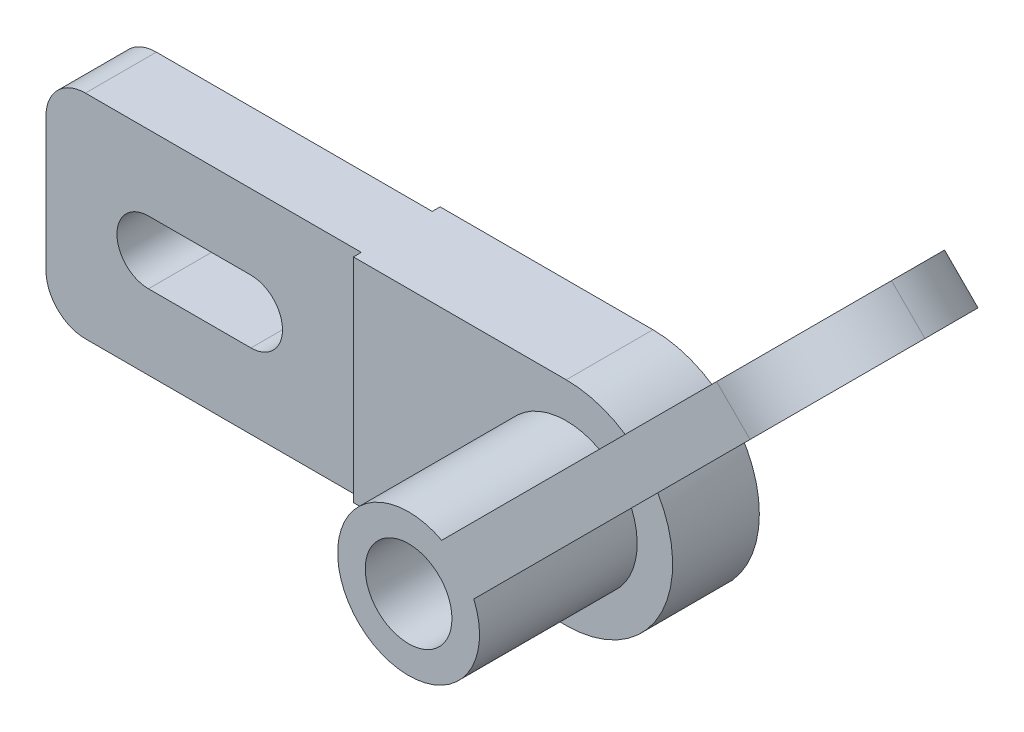
ISO-10303-21;
HEADER;
FILE_DESCRIPTION(('STEP AP214'),'2;1');
FILE_NAME('part.step','',(''),(''),'','','');
FILE_SCHEMA(('AUTOMOTIVE_DESIGN { 1 0 10303 214 1 1 1 1 }'));
ENDSEC;
DATA;
#1=APPLICATION_CONTEXT('core data for automotive mechanical design processes');
#2=APPLICATION_PROTOCOL_DEFINITION('international standard','automotive_design',2000,#1);
#3=PRODUCT_CONTEXT('',#1,'mechanical');
#4=PRODUCT('Part','Part','',(#3));
#5=PRODUCT_RELATED_PRODUCT_CATEGORY('part','',(#4));
#6=PRODUCT_DEFINITION_FORMATION('','',#4);
#7=PRODUCT_DEFINITION_CONTEXT('part definition',#1,'design');
#8=PRODUCT_DEFINITION('design','',#6,#7);
#9=PRODUCT_DEFINITION_SHAPE('','',#8);
#10=(LENGTH_UNIT() NAMED_UNIT(*) SI_UNIT(.MILLI.,.METRE.));
#11=(NAMED_UNIT(*) PLANE_ANGLE_UNIT() SI_UNIT($,.RADIAN.));
#12=(NAMED_UNIT(*) SI_UNIT($,.STERADIAN.) SOLID_ANGLE_UNIT());
#13=UNCERTAINTY_MEASURE_WITH_UNIT(LENGTH_MEASURE(1.E-05),#10,'distance_accuracy_value','');
#14=(GEOMETRIC_REPRESENTATION_CONTEXT(3) GLOBAL_UNCERTAINTY_ASSIGNED_CONTEXT((#13)) GLOBAL_UNIT_ASSIGNED_CONTEXT((#10,
#11,#12)) REPRESENTATION_CONTEXT('',''));
#15=CARTESIAN_POINT('',(0.,0.,0.));
#16=DIRECTION('',(0.,0.,1.));
#17=DIRECTION('',(1.,0.,0.));
#18=AXIS2_PLACEMENT_3D('',#15,#16,#17);
#19=CARTESIAN_POINT('',(-67.,13.5,11.));
#20=DIRECTION('',(1.,0.,0.));
#21=DIRECTION('',(0.,0.,-1.));
#22=AXIS2_PLACEMENT_3D('',#19,#20,#21);
#23=PLANE('',#22);
#24=DIRECTION('',(0.,-1.,0.));
#25=VECTOR('',#24,1.);
#26=CARTESIAN_POINT('',(-67.,13.5,1.));
#27=LINE('',#26,#25);
#28=CARTESIAN_POINT('',(-67.,8.5,1.));
#29=VERTEX_POINT('',#28);
#30=CARTESIAN_POINT('',(-67.,-8.5,1.));
#31=VERTEX_POINT('',#30);
#32=EDGE_CURVE('E269',#29,#31,#27,.T.);
#33=ORIENTED_EDGE('',*,*,#32,.T.);
#34=DIRECTION('',(0.,0.,-1.));
#35=VECTOR('',#34,1.);
#36=CARTESIAN_POINT('',(-67.,-8.5,11.));
#37=LINE('',#36,#35);
#38=CARTESIAN_POINT('',(-67.,-8.5,10.));
#39=VERTEX_POINT('',#38);
#40=EDGE_CURVE('E382',#31,#39,#37,.F.);
#41=ORIENTED_EDGE('',*,*,#40,.T.);
#42=DIRECTION('',(0.,-1.,0.));
#43=VECTOR('',#42,1.);
#44=CARTESIAN_POINT('',(-67.,13.5,10.));
#45=LINE('',#44,#43);
#46=CARTESIAN_POINT('',(-67.,8.5,10.));
#47=VERTEX_POINT('',#46);
#48=EDGE_CURVE('E288',#47,#39,#45,.T.);
#49=ORIENTED_EDGE('',*,*,#48,.F.);
#50=DIRECTION('',(0.,0.,-1.));
#51=VECTOR('',#50,1.);
#52=CARTESIAN_POINT('',(-67.,8.5,11.));
#53=LINE('',#52,#51);
#54=EDGE_CURVE('E379',#47,#29,#53,.T.);
#55=ORIENTED_EDGE('',*,*,#54,.T.);
#56=EDGE_LOOP('',(#33,#41,#49,#55));
#57=FACE_BOUND('',#56,.T.);
#58=ADVANCED_FACE('F33',(#57),#23,.F.);
#59=CARTESIAN_POINT('',(-54.,0.,-4.));
#60=DIRECTION('',(0.,0.,1.));
#61=DIRECTION('',(1.,0.,0.));
#62=AXIS2_PLACEMENT_3D('',#59,#60,#61);
#63=CYLINDRICAL_SURFACE('',#62,4.);
#64=CARTESIAN_POINT('',(-54.,0.,1.));
#65=DIRECTION('',(0.,0.,-1.));
#66=DIRECTION('',(-1.,0.,0.));
#67=AXIS2_PLACEMENT_3D('',#64,#65,#66);
#68=CIRCLE('',#67,4.);
#69=CARTESIAN_POINT('',(-54.,4.,1.));
#70=VERTEX_POINT('',#69);
#71=CARTESIAN_POINT('',(-54.,-4.,1.));
#72=VERTEX_POINT('',#71);
#73=EDGE_CURVE('E282',#70,#72,#68,.F.);
#74=ORIENTED_EDGE('',*,*,#73,.F.);
#75=DIRECTION('',(0.,0.,1.));
#76=VECTOR('',#75,1.);
#77=CARTESIAN_POINT('',(-54.,4.,-4.));
#78=LINE('',#77,#76);
#79=CARTESIAN_POINT('',(-54.,4.,10.));
#80=VERTEX_POINT('',#79);
#81=EDGE_CURVE('E319',#70,#80,#78,.T.);
#82=ORIENTED_EDGE('',*,*,#81,.T.);
#83=CARTESIAN_POINT('',(-54.,0.,10.));
#84=DIRECTION('',(0.,0.,1.));
#85=DIRECTION('',(1.,0.,0.));
#86=AXIS2_PLACEMENT_3D('',#83,#84,#85);
#87=CIRCLE('',#86,4.);
#88=CARTESIAN_POINT('',(-54.,-4.,10.));
#89=VERTEX_POINT('',#88);
#90=EDGE_CURVE('E309',#89,#80,#87,.F.);
#91=ORIENTED_EDGE('',*,*,#90,.F.);
#92=DIRECTION('',(0.,0.,1.));
#93=VECTOR('',#92,1.);
#94=CARTESIAN_POINT('',(-54.,-4.,-4.));
#95=LINE('',#94,#93);
#96=EDGE_CURVE('E316',#72,#89,#95,.T.);
#97=ORIENTED_EDGE('',*,*,#96,.F.);
#98=EDGE_LOOP('',(#74,#82,#91,#97));
#99=FACE_BOUND('',#98,.T.);
#100=ADVANCED_FACE('F413',(#99),#63,.F.);
#101=CARTESIAN_POINT('',(-54.,4.,-4.));
#102=DIRECTION('',(0.,1.,0.));
#103=DIRECTION('',(0.,0.,1.));
#104=AXIS2_PLACEMENT_3D('',#101,#102,#103);
#105=PLANE('',#104);
#106=DIRECTION('',(-1.,0.,0.));
#107=VECTOR('',#106,1.);
#108=CARTESIAN_POINT('',(-54.,4.,1.));
#109=LINE('',#108,#107);
#110=CARTESIAN_POINT('',(-41.,4.,1.));
#111=VERTEX_POINT('',#110);
#112=EDGE_CURVE('E280',#111,#70,#109,.T.);
#113=ORIENTED_EDGE('',*,*,#112,.F.);
#114=DIRECTION('',(0.,0.,1.));
#115=VECTOR('',#114,1.);
#116=CARTESIAN_POINT('',(-41.,4.,-4.));
#117=LINE('',#116,#115);
#118=CARTESIAN_POINT('',(-41.,4.,10.));
#119=VERTEX_POINT('',#118);
#120=EDGE_CURVE('E322',#111,#119,#117,.T.);
#121=ORIENTED_EDGE('',*,*,#120,.T.);
#122=DIRECTION('',(1.,0.,0.));
#123=VECTOR('',#122,1.);
#124=CARTESIAN_POINT('',(-54.,4.,10.));
#125=LINE('',#124,#123);
#126=EDGE_CURVE('E306',#80,#119,#125,.T.);
#127=ORIENTED_EDGE('',*,*,#126,.F.);
#128=ORIENTED_EDGE('',*,*,#81,.F.);
#129=EDGE_LOOP('',(#113,#121,#127,#128));
#130=FACE_BOUND('',#129,.T.);
#131=ADVANCED_FACE('F419',(#130),#105,.F.);
#132=CARTESIAN_POINT('',(-41.,0.,-4.));
#133=DIRECTION('',(0.,0.,1.));
#134=DIRECTION('',(1.,0.,0.));
#135=AXIS2_PLACEMENT_3D('',#132,#133,#134);
#136=CYLINDRICAL_SURFACE('',#135,4.);
#137=CARTESIAN_POINT('',(-41.,0.,1.));
#138=DIRECTION('',(0.,0.,-1.));
#139=DIRECTION('',(-1.,0.,0.));
#140=AXIS2_PLACEMENT_3D('',#137,#138,#139);
#141=CIRCLE('',#140,4.);
#142=CARTESIAN_POINT('',(-41.,-4.,1.));
#143=VERTEX_POINT('',#142);
#144=EDGE_CURVE('E277',#143,#111,#141,.F.);
#145=ORIENTED_EDGE('',*,*,#144,.F.);
#146=DIRECTION('',(0.,0.,1.));
#147=VECTOR('',#146,1.);
#148=CARTESIAN_POINT('',(-41.,-4.,-4.));
#149=LINE('',#148,#147);
#150=CARTESIAN_POINT('',(-41.,-4.,10.));
#151=VERTEX_POINT('',#150);
#152=EDGE_CURVE('E324',#143,#151,#149,.T.);
#153=ORIENTED_EDGE('',*,*,#152,.T.);
#154=CARTESIAN_POINT('',(-41.,0.,10.));
#155=DIRECTION('',(0.,0.,1.));
#156=DIRECTION('',(1.,0.,0.));
#157=AXIS2_PLACEMENT_3D('',#154,#155,#156);
#158=CIRCLE('',#157,4.);
#159=EDGE_CURVE('E302',#119,#151,#158,.F.);
#160=ORIENTED_EDGE('',*,*,#159,.F.);
#161=ORIENTED_EDGE('',*,*,#120,.F.);
#162=EDGE_LOOP('',(#145,#153,#160,#161));
#163=FACE_BOUND('',#162,.T.);
#164=ADVANCED_FACE('F535',(#163),#136,.F.);
#165=CARTESIAN_POINT('',(-54.,-4.,-4.));
#166=DIRECTION('',(0.,-1.,0.));
#167=DIRECTION('',(0.,0.,-1.));
#168=AXIS2_PLACEMENT_3D('',#165,#166,#167);
#169=PLANE('',#168);
#170=DIRECTION('',(1.,0.,0.));
#171=VECTOR('',#170,1.);
#172=CARTESIAN_POINT('',(-54.,-4.,1.));
#173=LINE('',#172,#171);
#174=EDGE_CURVE('E352',#72,#143,#173,.T.);
#175=ORIENTED_EDGE('',*,*,#174,.F.);
#176=ORIENTED_EDGE('',*,*,#96,.T.);
#177=DIRECTION('',(-1.,0.,0.));
#178=VECTOR('',#177,1.);
#179=CARTESIAN_POINT('',(-54.,-4.,10.));
#180=LINE('',#179,#178);
#181=EDGE_CURVE('E349',#151,#89,#180,.T.);
#182=ORIENTED_EDGE('',*,*,#181,.F.);
#183=ORIENTED_EDGE('',*,*,#152,.F.);
#184=EDGE_LOOP('',(#175,#176,#182,#183));
#185=FACE_BOUND('',#184,.T.);
#186=ADVANCED_FACE('F429',(#185),#169,.F.);
#187=CARTESIAN_POINT('',(-67.,13.5,11.));
#188=DIRECTION('',(0.,-1.,0.));
#189=DIRECTION('',(0.,0.,-1.));
#190=AXIS2_PLACEMENT_3D('',#187,#188,#189);
#191=PLANE('',#190);
#192=DIRECTION('',(-1.,0.,0.));
#193=VECTOR('',#192,1.);
#194=CARTESIAN_POINT('',(-27.,13.5,1.));
#195=LINE('',#194,#193);
#196=CARTESIAN_POINT('',(-27.,13.5,1.));
#197=VERTEX_POINT('',#196);
#198=CARTESIAN_POINT('',(-62.,13.5,1.));
#199=VERTEX_POINT('',#198);
#200=EDGE_CURVE('E261',#197,#199,#195,.T.);
#201=ORIENTED_EDGE('',*,*,#200,.T.);
#202=DIRECTION('',(0.,0.,-1.));
#203=VECTOR('',#202,1.);
#204=CARTESIAN_POINT('',(-62.,13.5,11.));
#205=LINE('',#204,#203);
#206=CARTESIAN_POINT('',(-62.,13.5,10.));
#207=VERTEX_POINT('',#206);
#208=EDGE_CURVE('E388',#199,#207,#205,.F.);
#209=ORIENTED_EDGE('',*,*,#208,.T.);
#210=DIRECTION('',(-1.,0.,0.));
#211=VECTOR('',#210,1.);
#212=CARTESIAN_POINT('',(-27.,13.5,10.));
#213=LINE('',#212,#211);
#214=CARTESIAN_POINT('',(-27.,13.5,10.));
#215=VERTEX_POINT('',#214);
#216=EDGE_CURVE('E285',#215,#207,#213,.T.);
#217=ORIENTED_EDGE('',*,*,#216,.F.);
#218=DIRECTION('',(0.,0.,1.));
#219=VECTOR('',#218,1.);
#220=CARTESIAN_POINT('',(-27.,13.5,10.));
#221=LINE('',#220,#219);
#222=CARTESIAN_POINT('',(-27.,13.5,11.));
#223=VERTEX_POINT('',#222);
#224=EDGE_CURVE('E299',#215,#223,#221,.T.);
#225=ORIENTED_EDGE('',*,*,#224,.T.);
#226=DIRECTION('',(-1.,0.,0.));
#227=VECTOR('',#226,1.);
#228=CARTESIAN_POINT('',(-67.,13.5,11.));
#229=LINE('',#228,#227);
#230=CARTESIAN_POINT('',(0.,13.5,11.));
#231=VERTEX_POINT('',#230);
#232=EDGE_CURVE('E330',#231,#223,#229,.T.);
#233=ORIENTED_EDGE('',*,*,#232,.F.);
#234=DIRECTION('',(0.,0.,-1.));
#235=VECTOR('',#234,1.);
#236=CARTESIAN_POINT('',(0.,13.5,11.));
#237=LINE('',#236,#235);
#238=CARTESIAN_POINT('',(0.,13.5,0.));
#239=VERTEX_POINT('',#238);
#240=EDGE_CURVE('E346',#231,#239,#237,.T.);
#241=ORIENTED_EDGE('',*,*,#240,.T.);
#242=DIRECTION('',(-1.,0.,0.));
#243=VECTOR('',#242,1.);
#244=CARTESIAN_POINT('',(-67.,13.5,0.));
#245=LINE('',#244,#243);
#246=CARTESIAN_POINT('',(-27.,13.5,0.));
#247=VERTEX_POINT('',#246);
#248=EDGE_CURVE('E339',#239,#247,#245,.T.);
#249=ORIENTED_EDGE('',*,*,#248,.T.);
#250=DIRECTION('',(0.,0.,-1.));
#251=VECTOR('',#250,1.);
#252=CARTESIAN_POINT('',(-27.,13.5,1.));
#253=LINE('',#252,#251);
#254=EDGE_CURVE('E272',#197,#247,#253,.T.);
#255=ORIENTED_EDGE('',*,*,#254,.F.);
#256=EDGE_LOOP('',(#201,#209,#217,#225,#233,#241,#249,#255));
#257=FACE_BOUND('',#256,.T.);
#258=ADVANCED_FACE('F426',(#257),#191,.F.);
#259=CARTESIAN_POINT('',(-67.,-13.5,11.));
#260=DIRECTION('',(0.,1.,0.));
#261=DIRECTION('',(0.,0.,1.));
#262=AXIS2_PLACEMENT_3D('',#259,#260,#261);
#263=PLANE('',#262);
#264=DIRECTION('',(1.,0.,0.));
#265=VECTOR('',#264,1.);
#266=CARTESIAN_POINT('',(-67.,-13.5,10.));
#267=LINE('',#266,#265);
#268=CARTESIAN_POINT('',(-62.,-13.5,10.));
#269=VERTEX_POINT('',#268);
#270=CARTESIAN_POINT('',(-27.,-13.5,10.));
#271=VERTEX_POINT('',#270);
#272=EDGE_CURVE('E291',#269,#271,#267,.T.);
#273=ORIENTED_EDGE('',*,*,#272,.F.);
#274=DIRECTION('',(0.,0.,-1.));
#275=VECTOR('',#274,1.);
#276=CARTESIAN_POINT('',(-62.,-13.5,11.));
#277=LINE('',#276,#275);
#278=CARTESIAN_POINT('',(-62.,-13.5,1.));
#279=VERTEX_POINT('',#278);
#280=EDGE_CURVE('E370',#269,#279,#277,.T.);
#281=ORIENTED_EDGE('',*,*,#280,.T.);
#282=DIRECTION('',(1.,0.,0.));
#283=VECTOR('',#282,1.);
#284=CARTESIAN_POINT('',(-67.,-13.5,1.));
#285=LINE('',#284,#283);
#286=CARTESIAN_POINT('',(-27.,-13.5,1.));
#287=VERTEX_POINT('',#286);
#288=EDGE_CURVE('E267',#279,#287,#285,.T.);
#289=ORIENTED_EDGE('',*,*,#288,.T.);
#290=DIRECTION('',(0.,0.,-1.));
#291=VECTOR('',#290,1.);
#292=CARTESIAN_POINT('',(-27.,-13.5,1.));
#293=LINE('',#292,#291);
#294=CARTESIAN_POINT('',(-27.,-13.5,0.));
#295=VERTEX_POINT('',#294);
#296=EDGE_CURVE('E274',#287,#295,#293,.T.);
#297=ORIENTED_EDGE('',*,*,#296,.T.);
#298=DIRECTION('',(1.,0.,0.));
#299=VECTOR('',#298,1.);
#300=CARTESIAN_POINT('',(-67.,-13.5,0.));
#301=LINE('',#300,#299);
#302=CARTESIAN_POINT('',(0.,-13.5,0.));
#303=VERTEX_POINT('',#302);
#304=EDGE_CURVE('E342',#295,#303,#301,.T.);
#305=ORIENTED_EDGE('',*,*,#304,.T.);
#306=DIRECTION('',(0.,0.,-1.));
#307=VECTOR('',#306,1.);
#308=CARTESIAN_POINT('',(0.,-13.5,11.));
#309=LINE('',#308,#307);
#310=CARTESIAN_POINT('',(0.,-13.5,11.));
#311=VERTEX_POINT('',#310);
#312=EDGE_CURVE('E336',#311,#303,#309,.T.);
#313=ORIENTED_EDGE('',*,*,#312,.F.);
#314=DIRECTION('',(1.,0.,0.));
#315=VECTOR('',#314,1.);
#316=CARTESIAN_POINT('',(-67.,-13.5,11.));
#317=LINE('',#316,#315);
#318=CARTESIAN_POINT('',(-27.,-13.5,11.));
#319=VERTEX_POINT('',#318);
#320=EDGE_CURVE('E334',#319,#311,#317,.T.);
#321=ORIENTED_EDGE('',*,*,#320,.F.);
#322=DIRECTION('',(0.,0.,1.));
#323=VECTOR('',#322,1.);
#324=CARTESIAN_POINT('',(-27.,-13.5,10.));
#325=LINE('',#324,#323);
#326=EDGE_CURVE('E296',#271,#319,#325,.T.);
#327=ORIENTED_EDGE('',*,*,#326,.F.);
#328=EDGE_LOOP('',(#273,#281,#289,#297,#305,#313,#321,#327));
#329=FACE_BOUND('',#328,.T.);
#330=ADVANCED_FACE('F424',(#329),#263,.F.);
#331=CARTESIAN_POINT('',(0.,0.,11.));
#332=DIRECTION('',(0.,0.,1.));
#333=DIRECTION('',(1.,0.,0.));
#334=AXIS2_PLACEMENT_3D('',#331,#332,#333);
#335=PLANE('',#334);
#336=DIRECTION('',(0.707106781186548,0.707106781186548,0.));
#337=VECTOR('',#336,1.);
#338=CARTESIAN_POINT('',(2.36073542094923,-2.36073542094923,11.));
#339=LINE('',#338,#337);
#340=CARTESIAN_POINT('',(8.27063628917669,3.54916544727823,11.));
#341=VERTEX_POINT('',#340);
#342=CARTESIAN_POINT('',(11.610163958555,6.88869311665652,11.));
#343=VERTEX_POINT('',#342);
#344=EDGE_CURVE('E249',#341,#343,#339,.T.);
#345=ORIENTED_EDGE('',*,*,#344,.F.);
#346=CARTESIAN_POINT('',(0.,0.,11.));
#347=DIRECTION('',(0.,0.,1.));
#348=DIRECTION('',(1.,0.,0.));
#349=AXIS2_PLACEMENT_3D('',#346,#347,#348);
#350=CIRCLE('',#349,9.);
#351=CARTESIAN_POINT('',(4.19743948216932,7.96125001450942,11.));
#352=VERTEX_POINT('',#351);
#353=EDGE_CURVE('E312',#352,#341,#350,.T.);
#354=ORIENTED_EDGE('',*,*,#353,.F.);
#355=DIRECTION('',(-0.707106781186548,-0.707106781186548,0.));
#356=VECTOR('',#355,1.);
#357=CARTESIAN_POINT('',(-1.88190526617005,1.88190526617005,11.));
#358=LINE('',#357,#356);
#359=CARTESIAN_POINT('',(7.47669679659346,11.2405073289336,11.));
#360=VERTEX_POINT('',#359);
#361=EDGE_CURVE('E241',#360,#352,#358,.T.);
#362=ORIENTED_EDGE('',*,*,#361,.F.);
#363=CARTESIAN_POINT('',(0.,0.,11.));
#364=DIRECTION('',(0.,0.,1.));
#365=DIRECTION('',(1.,0.,0.));
#366=AXIS2_PLACEMENT_3D('',#363,#364,#365);
#367=CIRCLE('',#366,13.5);
#368=EDGE_CURVE('E331',#360,#231,#367,.T.);
#369=ORIENTED_EDGE('',*,*,#368,.T.);
#370=ORIENTED_EDGE('',*,*,#232,.T.);
#371=DIRECTION('',(0.,-1.,0.));
#372=VECTOR('',#371,1.);
#373=CARTESIAN_POINT('',(-27.,13.5,11.));
#374=LINE('',#373,#372);
#375=EDGE_CURVE('E284',#223,#319,#374,.T.);
#376=ORIENTED_EDGE('',*,*,#375,.T.);
#377=ORIENTED_EDGE('',*,*,#320,.T.);
#378=EDGE_CURVE('E327',#311,#343,#367,.T.);
#379=ORIENTED_EDGE('',*,*,#378,.T.);
#380=EDGE_LOOP('',(#345,#354,#362,#369,#370,#376,#377,#379));
#381=FACE_BOUND('',#380,.T.);
#382=ADVANCED_FACE('F435',(#381),#335,.T.);
#383=CARTESIAN_POINT('',(0.,0.,11.));
#384=DIRECTION('',(0.,0.,-1.));
#385=DIRECTION('',(-1.,0.,0.));
#386=AXIS2_PLACEMENT_3D('',#383,#384,#385);
#387=CYLINDRICAL_SURFACE('',#386,13.5);
#388=CARTESIAN_POINT('',(0.,0.,5.));
#389=DIRECTION('',(0.,0.,-1.));
#390=DIRECTION('',(-1.,0.,0.));
#391=AXIS2_PLACEMENT_3D('',#388,#389,#390);
#392=CIRCLE('',#391,13.5);
#393=CARTESIAN_POINT('',(7.47669679659346,11.2405073289336,5.));
#394=VERTEX_POINT('',#393);
#395=CARTESIAN_POINT('',(11.610163958555,6.88869311665652,5.));
#396=VERTEX_POINT('',#395);
#397=EDGE_CURVE('E354',#394,#396,#392,.T.);
#398=ORIENTED_EDGE('',*,*,#397,.T.);
#399=DIRECTION('',(0.,0.,-1.));
#400=VECTOR('',#399,1.);
#401=CARTESIAN_POINT('',(11.610163958555,6.88869311665652,11.));
#402=LINE('',#401,#400);
#403=EDGE_CURVE('E251',#396,#343,#402,.F.);
#404=ORIENTED_EDGE('',*,*,#403,.T.);
#405=ORIENTED_EDGE('',*,*,#378,.F.);
#406=ORIENTED_EDGE('',*,*,#312,.T.);
#407=CARTESIAN_POINT('',(0.,0.,0.));
#408=DIRECTION('',(0.,0.,1.));
#409=DIRECTION('',(1.,0.,0.));
#410=AXIS2_PLACEMENT_3D('',#407,#408,#409);
#411=CIRCLE('',#410,13.5);
#412=EDGE_CURVE('E321',#303,#239,#411,.T.);
#413=ORIENTED_EDGE('',*,*,#412,.T.);
#414=ORIENTED_EDGE('',*,*,#240,.F.);
#415=ORIENTED_EDGE('',*,*,#368,.F.);
#416=DIRECTION('',(0.,0.,-1.));
#417=VECTOR('',#416,1.);
#418=CARTESIAN_POINT('',(7.47669679659346,11.2405073289336,11.));
#419=LINE('',#418,#417);
#420=EDGE_CURVE('E243',#360,#394,#419,.T.);
#421=ORIENTED_EDGE('',*,*,#420,.T.);
#422=EDGE_LOOP('',(#398,#404,#405,#406,#413,#414,#415,#421));
#423=FACE_BOUND('',#422,.T.);
#424=ADVANCED_FACE('F431',(#423),#387,.T.);
#425=CARTESIAN_POINT('',(0.,0.,0.));
#426=DIRECTION('',(0.,0.,1.));
#427=DIRECTION('',(1.,0.,0.));
#428=AXIS2_PLACEMENT_3D('',#425,#426,#427);
#429=PLANE('',#428);
#430=CARTESIAN_POINT('',(0.,0.,0.));
#431=DIRECTION('',(0.,0.,1.));
#432=DIRECTION('',(1.,0.,0.));
#433=AXIS2_PLACEMENT_3D('',#430,#431,#432);
#434=CIRCLE('',#433,5.5);
#435=CARTESIAN_POINT('',(5.5,0.,0.));
#436=VERTEX_POINT('',#435);
#437=EDGE_CURVE('E255',#436,#436,#434,.T.);
#438=ORIENTED_EDGE('',*,*,#437,.T.);
#439=EDGE_LOOP('',(#438));
#440=FACE_BOUND('',#439,.T.);
#441=ORIENTED_EDGE('',*,*,#304,.F.);
#442=DIRECTION('',(0.,-1.,0.));
#443=VECTOR('',#442,1.);
#444=CARTESIAN_POINT('',(-27.,13.5,0.));
#445=LINE('',#444,#443);
#446=EDGE_CURVE('E258',#247,#295,#445,.T.);
#447=ORIENTED_EDGE('',*,*,#446,.F.);
#448=ORIENTED_EDGE('',*,*,#248,.F.);
#449=ORIENTED_EDGE('',*,*,#412,.F.);
#450=EDGE_LOOP('',(#441,#447,#448,#449));
#451=FACE_BOUND('',#450,.T.);
#452=ADVANCED_FACE('F434',(#440,#451),#429,.F.);
#453=CARTESIAN_POINT('',(0.,0.,31.));
#454=DIRECTION('',(0.,0.,-1.));
#455=DIRECTION('',(-1.,0.,0.));
#456=AXIS2_PLACEMENT_3D('',#453,#454,#455);
#457=CYLINDRICAL_SURFACE('',#456,9.);
#458=ORIENTED_EDGE('',*,*,#353,.T.);
#459=DIRECTION('',(0.,0.,-1.));
#460=VECTOR('',#459,1.);
#461=CARTESIAN_POINT('',(8.27063628917669,3.54916544727823,31.));
#462=LINE('',#461,#460);
#463=CARTESIAN_POINT('',(8.27063628917669,3.54916544727823,31.));
#464=VERTEX_POINT('',#463);
#465=EDGE_CURVE('E246',#341,#464,#462,.F.);
#466=ORIENTED_EDGE('',*,*,#465,.T.);
#467=CARTESIAN_POINT('',(0.,0.,31.));
#468=DIRECTION('',(0.,0.,1.));
#469=DIRECTION('',(1.,0.,0.));
#470=AXIS2_PLACEMENT_3D('',#467,#468,#469);
#471=CIRCLE('',#470,9.);
#472=CARTESIAN_POINT('',(4.19743948216932,7.96125001450942,31.));
#473=VERTEX_POINT('',#472);
#474=EDGE_CURVE('E313',#473,#464,#471,.T.);
#475=ORIENTED_EDGE('',*,*,#474,.F.);
#476=DIRECTION('',(0.,0.,-1.));
#477=VECTOR('',#476,1.);
#478=CARTESIAN_POINT('',(4.19743948216932,7.96125001450942,31.));
#479=LINE('',#478,#477);
#480=EDGE_CURVE('E234',#473,#352,#479,.T.);
#481=ORIENTED_EDGE('',*,*,#480,.T.);
#482=EDGE_LOOP('',(#458,#466,#475,#481));
#483=FACE_BOUND('',#482,.T.);
#484=ADVANCED_FACE('F491',(#483),#457,.T.);
#485=CARTESIAN_POINT('',(0.,0.,31.));
#486=DIRECTION('',(0.,0.,1.));
#487=DIRECTION('',(1.,0.,0.));
#488=AXIS2_PLACEMENT_3D('',#485,#486,#487);
#489=PLANE('',#488);
#490=DIRECTION('',(0.707106781186547,0.707106781186547,0.));
#491=VECTOR('',#490,1.);
#492=CARTESIAN_POINT('',(52.5097825531957,47.7883117112972,31.));
#493=LINE('',#492,#491);
#494=CARTESIAN_POINT('',(43.3173943977706,38.5959235558721,31.));
#495=VERTEX_POINT('',#494);
#496=EDGE_CURVE('E231',#464,#495,#493,.T.);
#497=ORIENTED_EDGE('',*,*,#496,.T.);
#498=DIRECTION('',(-0.707106781186548,0.707106781186548,0.));
#499=VECTOR('',#498,1.);
#500=CARTESIAN_POINT('',(40.9566589768213,40.9566589768213,31.));
#501=LINE('',#500,#499);
#502=CARTESIAN_POINT('',(39.0747537106513,42.8385642429914,31.));
#503=VERTEX_POINT('',#502);
#504=EDGE_CURVE('E357',#495,#503,#501,.T.);
#505=ORIENTED_EDGE('',*,*,#504,.T.);
#506=DIRECTION('',(-0.707106781186547,-0.707106781186547,0.));
#507=VECTOR('',#506,1.);
#508=CARTESIAN_POINT('',(48.2671418660764,52.0309523984165,31.));
#509=LINE('',#508,#507);
#510=EDGE_CURVE('E235',#503,#473,#509,.T.);
#511=ORIENTED_EDGE('',*,*,#510,.T.);
#512=ORIENTED_EDGE('',*,*,#474,.T.);
#513=EDGE_LOOP('',(#497,#505,#511,#512));
#514=FACE_BOUND('',#513,.T.);
#515=CARTESIAN_POINT('',(0.,0.,31.));
#516=DIRECTION('',(0.,0.,1.));
#517=DIRECTION('',(1.,0.,0.));
#518=AXIS2_PLACEMENT_3D('',#515,#516,#517);
#519=CIRCLE('',#518,5.5);
#520=CARTESIAN_POINT('',(5.5,0.,31.));
#521=VERTEX_POINT('',#520);
#522=EDGE_CURVE('E254',#521,#521,#519,.T.);
#523=ORIENTED_EDGE('',*,*,#522,.F.);
#524=EDGE_LOOP('',(#523));
#525=FACE_BOUND('',#524,.T.);
#526=ADVANCED_FACE('F506',(#514,#525),#489,.T.);
#527=CARTESIAN_POINT('',(0.,0.,10.));
#528=DIRECTION('',(0.,0.,1.));
#529=DIRECTION('',(1.,0.,0.));
#530=AXIS2_PLACEMENT_3D('',#527,#528,#529);
#531=PLANE('',#530);
#532=ORIENTED_EDGE('',*,*,#48,.T.);
#533=CARTESIAN_POINT('',(-62.,-8.5,10.));
#534=DIRECTION('',(0.,0.,1.));
#535=DIRECTION('',(1.,0.,0.));
#536=AXIS2_PLACEMENT_3D('',#533,#534,#535);
#537=CIRCLE('',#536,5.);
#538=EDGE_CURVE('E386',#39,#269,#537,.T.);
#539=ORIENTED_EDGE('',*,*,#538,.T.);
#540=ORIENTED_EDGE('',*,*,#272,.T.);
#541=DIRECTION('',(0.,-1.,0.));
#542=VECTOR('',#541,1.);
#543=CARTESIAN_POINT('',(-27.,13.5,10.));
#544=LINE('',#543,#542);
#545=EDGE_CURVE('E293',#215,#271,#544,.T.);
#546=ORIENTED_EDGE('',*,*,#545,.F.);
#547=ORIENTED_EDGE('',*,*,#216,.T.);
#548=CARTESIAN_POINT('',(-62.,8.5,10.));
#549=DIRECTION('',(0.,0.,1.));
#550=DIRECTION('',(1.,0.,0.));
#551=AXIS2_PLACEMENT_3D('',#548,#549,#550);
#552=CIRCLE('',#551,5.);
#553=EDGE_CURVE('E384',#207,#47,#552,.T.);
#554=ORIENTED_EDGE('',*,*,#553,.T.);
#555=EDGE_LOOP('',(#532,#539,#540,#546,#547,#554));
#556=FACE_BOUND('',#555,.T.);
#557=ORIENTED_EDGE('',*,*,#90,.T.);
#558=ORIENTED_EDGE('',*,*,#126,.T.);
#559=ORIENTED_EDGE('',*,*,#159,.T.);
#560=ORIENTED_EDGE('',*,*,#181,.T.);
#561=EDGE_LOOP('',(#557,#558,#559,#560));
#562=FACE_BOUND('',#561,.T.);
#563=ADVANCED_FACE('F454',(#556,#562),#531,.T.);
#564=CARTESIAN_POINT('',(-27.,13.5,10.));
#565=DIRECTION('',(-1.,0.,0.));
#566=DIRECTION('',(0.,0.,1.));
#567=AXIS2_PLACEMENT_3D('',#564,#565,#566);
#568=PLANE('',#567);
#569=ORIENTED_EDGE('',*,*,#375,.F.);
#570=ORIENTED_EDGE('',*,*,#224,.F.);
#571=ORIENTED_EDGE('',*,*,#545,.T.);
#572=ORIENTED_EDGE('',*,*,#326,.T.);
#573=EDGE_LOOP('',(#569,#570,#571,#572));
#574=FACE_BOUND('',#573,.T.);
#575=ADVANCED_FACE('F464',(#574),#568,.T.);
#576=CARTESIAN_POINT('',(0.,0.,1.));
#577=DIRECTION('',(0.,0.,-1.));
#578=DIRECTION('',(1.,0.,0.));
#579=AXIS2_PLACEMENT_3D('',#576,#577,#578);
#580=PLANE('',#579);
#581=ORIENTED_EDGE('',*,*,#288,.F.);
#582=CARTESIAN_POINT('',(-62.,-8.5,1.));
#583=DIRECTION('',(0.,0.,-1.));
#584=DIRECTION('',(-1.,0.,0.));
#585=AXIS2_PLACEMENT_3D('',#582,#583,#584);
#586=CIRCLE('',#585,5.);
#587=EDGE_CURVE('E377',#279,#31,#586,.T.);
#588=ORIENTED_EDGE('',*,*,#587,.T.);
#589=ORIENTED_EDGE('',*,*,#32,.F.);
#590=CARTESIAN_POINT('',(-62.,8.5,1.));
#591=DIRECTION('',(0.,0.,-1.));
#592=DIRECTION('',(-1.,0.,0.));
#593=AXIS2_PLACEMENT_3D('',#590,#591,#592);
#594=CIRCLE('',#593,5.);
#595=EDGE_CURVE('E375',#29,#199,#594,.T.);
#596=ORIENTED_EDGE('',*,*,#595,.T.);
#597=ORIENTED_EDGE('',*,*,#200,.F.);
#598=DIRECTION('',(0.,-1.,0.));
#599=VECTOR('',#598,1.);
#600=CARTESIAN_POINT('',(-27.,13.5,1.));
#601=LINE('',#600,#599);
#602=EDGE_CURVE('E264',#197,#287,#601,.T.);
#603=ORIENTED_EDGE('',*,*,#602,.T.);
#604=EDGE_LOOP('',(#581,#588,#589,#596,#597,#603));
#605=FACE_BOUND('',#604,.T.);
#606=ORIENTED_EDGE('',*,*,#73,.T.);
#607=ORIENTED_EDGE('',*,*,#174,.T.);
#608=ORIENTED_EDGE('',*,*,#144,.T.);
#609=ORIENTED_EDGE('',*,*,#112,.T.);
#610=EDGE_LOOP('',(#606,#607,#608,#609));
#611=FACE_BOUND('',#610,.T.);
#612=ADVANCED_FACE('F484',(#605,#611),#580,.T.);
#613=CARTESIAN_POINT('',(-27.,13.5,1.));
#614=DIRECTION('',(1.,0.,0.));
#615=DIRECTION('',(0.,0.,-1.));
#616=AXIS2_PLACEMENT_3D('',#613,#614,#615);
#617=PLANE('',#616);
#618=ORIENTED_EDGE('',*,*,#446,.T.);
#619=ORIENTED_EDGE('',*,*,#296,.F.);
#620=ORIENTED_EDGE('',*,*,#602,.F.);
#621=ORIENTED_EDGE('',*,*,#254,.T.);
#622=EDGE_LOOP('',(#618,#619,#620,#621));
#623=FACE_BOUND('',#622,.T.);
#624=ADVANCED_FACE('F481',(#623),#617,.F.);
#625=CARTESIAN_POINT('',(0.,0.,0.));
#626=DIRECTION('',(0.,0.,1.));
#627=DIRECTION('',(1.,0.,0.));
#628=AXIS2_PLACEMENT_3D('',#625,#626,#627);
#629=CYLINDRICAL_SURFACE('',#628,5.5);
#630=ORIENTED_EDGE('',*,*,#437,.F.);
#631=EDGE_LOOP('',(#630));
#632=FACE_BOUND('',#631,.T.);
#633=ORIENTED_EDGE('',*,*,#522,.T.);
#634=EDGE_LOOP('',(#633));
#635=FACE_BOUND('',#634,.T.);
#636=ADVANCED_FACE('F512',(#632,#635),#629,.F.);
#637=CARTESIAN_POINT('',(52.5097825531957,47.7883117112972,5.));
#638=DIRECTION('',(0.707106781186548,-0.707106781186548,0.));
#639=DIRECTION('',(0.707106781186548,0.707106781186548,0.));
#640=AXIS2_PLACEMENT_3D('',#637,#638,#639);
#641=PLANE('',#640);
#642=CARTESIAN_POINT('',(43.372928729769,38.6514578878705,18.));
#643=DIRECTION('',(0.707106781186548,-0.707106781186547,0.));
#644=DIRECTION('',(0.707106781186547,0.707106781186548,0.));
#645=AXIS2_PLACEMENT_3D('',#642,#643,#644);
#646=CIRCLE('',#645,4.);
#647=CARTESIAN_POINT('',(43.372928729769,38.6514578878705,14.));
#648=VERTEX_POINT('',#647);
#649=CARTESIAN_POINT('',(43.372928729769,38.6514578878705,22.));
#650=VERTEX_POINT('',#649);
#651=EDGE_CURVE('E48',#648,#650,#646,.T.);
#652=ORIENTED_EDGE('',*,*,#651,.F.);
#653=DIRECTION('',(0.707106781186547,0.707106781186548,0.));
#654=VECTOR('',#653,1.);
#655=CARTESIAN_POINT('',(43.372928729769,38.6514578878705,14.));
#656=LINE('',#655,#654);
#657=CARTESIAN_POINT('',(23.5739388565457,18.8524680146472,14.));
#658=VERTEX_POINT('',#657);
#659=EDGE_CURVE('E218',#658,#648,#656,.T.);
#660=ORIENTED_EDGE('',*,*,#659,.F.);
#661=CARTESIAN_POINT('',(23.5739388565457,18.8524680146472,18.));
#662=DIRECTION('',(0.707106781186548,-0.707106781186547,0.));
#663=DIRECTION('',(0.707106781186547,0.707106781186548,0.));
#664=AXIS2_PLACEMENT_3D('',#661,#662,#663);
#665=CIRCLE('',#664,4.);
#666=CARTESIAN_POINT('',(23.5739388565457,18.8524680146472,22.));
#667=VERTEX_POINT('',#666);
#668=EDGE_CURVE('E202',#667,#658,#665,.T.);
#669=ORIENTED_EDGE('',*,*,#668,.F.);
#670=DIRECTION('',(-0.707106781186547,-0.707106781186548,0.));
#671=VECTOR('',#670,1.);
#672=CARTESIAN_POINT('',(43.372928729769,38.6514578878705,22.));
#673=LINE('',#672,#671);
#674=EDGE_CURVE('E211',#650,#667,#673,.T.);
#675=ORIENTED_EDGE('',*,*,#674,.F.);
#676=EDGE_LOOP('',(#652,#660,#669,#675));
#677=FACE_BOUND('',#676,.T.);
#678=CARTESIAN_POINT('',(43.3173943977706,38.5959235558721,18.));
#679=DIRECTION('',(0.707106781186548,-0.707106781186548,0.));
#680=DIRECTION('',(0.707106781186548,0.707106781186548,0.));
#681=AXIS2_PLACEMENT_3D('',#678,#679,#680);
#682=CIRCLE('',#681,13.);
#683=CARTESIAN_POINT('',(43.3173943977706,38.5959235558721,5.));
#684=VERTEX_POINT('',#683);
#685=CARTESIAN_POINT('',(52.5097825531957,47.7883117112972,18.));
#686=VERTEX_POINT('',#685);
#687=EDGE_CURVE('E364',#684,#686,#682,.T.);
#688=ORIENTED_EDGE('',*,*,#687,.T.);
#689=CARTESIAN_POINT('',(43.3173943977705,38.5959235558721,18.));
#690=DIRECTION('',(0.707106781186548,-0.707106781186548,0.));
#691=DIRECTION('',(0.707106781186548,0.707106781186548,0.));
#692=AXIS2_PLACEMENT_3D('',#689,#690,#691);
#693=CIRCLE('',#692,13.);
#694=EDGE_CURVE('E366',#686,#495,#693,.T.);
#695=ORIENTED_EDGE('',*,*,#694,.T.);
#696=ORIENTED_EDGE('',*,*,#496,.F.);
#697=ORIENTED_EDGE('',*,*,#465,.F.);
#698=ORIENTED_EDGE('',*,*,#344,.T.);
#699=ORIENTED_EDGE('',*,*,#403,.F.);
#700=DIRECTION('',(0.707106781186547,0.707106781186547,0.));
#701=VECTOR('',#700,1.);
#702=CARTESIAN_POINT('',(52.5097825531957,47.7883117112972,5.));
#703=LINE('',#702,#701);
#704=EDGE_CURVE('E230',#396,#684,#703,.T.);
#705=ORIENTED_EDGE('',*,*,#704,.T.);
#706=EDGE_LOOP('',(#688,#695,#696,#697,#698,#699,#705));
#707=FACE_BOUND('',#706,.T.);
#708=ADVANCED_FACE('F215',(#677,#707),#641,.T.);
#709=CARTESIAN_POINT('',(48.2671418660764,52.0309523984165,5.));
#710=DIRECTION('',(-0.707106781186548,0.707106781186548,0.));
#711=DIRECTION('',(-0.707106781186548,-0.707106781186548,0.));
#712=AXIS2_PLACEMENT_3D('',#709,#710,#711);
#713=PLANE('',#712);
#714=CARTESIAN_POINT('',(39.1302880426497,42.8940985749898,18.));
#715=DIRECTION('',(-0.707106781186548,0.707106781186548,0.));
#716=DIRECTION('',(-0.707106781186548,-0.707106781186548,0.));
#717=AXIS2_PLACEMENT_3D('',#714,#715,#716);
#718=CIRCLE('',#717,4.);
#719=CARTESIAN_POINT('',(39.1302880426497,42.8940985749898,22.));
#720=VERTEX_POINT('',#719);
#721=CARTESIAN_POINT('',(39.1302880426497,42.8940985749898,14.));
#722=VERTEX_POINT('',#721);
#723=EDGE_CURVE('E11',#720,#722,#718,.T.);
#724=ORIENTED_EDGE('',*,*,#723,.F.);
#725=DIRECTION('',(0.707106781186548,0.707106781186548,0.));
#726=VECTOR('',#725,1.);
#727=CARTESIAN_POINT('',(48.2671418660764,52.0309523984165,22.));
#728=LINE('',#727,#726);
#729=CARTESIAN_POINT('',(19.3312981694264,23.0951087017665,22.));
#730=VERTEX_POINT('',#729);
#731=EDGE_CURVE('E390',#730,#720,#728,.T.);
#732=ORIENTED_EDGE('',*,*,#731,.F.);
#733=CARTESIAN_POINT('',(19.3312981694264,23.0951087017665,18.));
#734=DIRECTION('',(-0.707106781186548,0.707106781186548,0.));
#735=DIRECTION('',(-0.707106781186548,-0.707106781186548,0.));
#736=AXIS2_PLACEMENT_3D('',#733,#734,#735);
#737=CIRCLE('',#736,4.);
#738=CARTESIAN_POINT('',(19.3312981694264,23.0951087017665,14.));
#739=VERTEX_POINT('',#738);
#740=EDGE_CURVE('E205',#739,#730,#737,.T.);
#741=ORIENTED_EDGE('',*,*,#740,.F.);
#742=DIRECTION('',(-0.707106781186548,-0.707106781186548,0.));
#743=VECTOR('',#742,1.);
#744=CARTESIAN_POINT('',(48.2671418660764,52.0309523984165,14.));
#745=LINE('',#744,#743);
#746=EDGE_CURVE('E41',#722,#739,#745,.T.);
#747=ORIENTED_EDGE('',*,*,#746,.F.);
#748=EDGE_LOOP('',(#724,#732,#741,#747));
#749=FACE_BOUND('',#748,.T.);
#750=ORIENTED_EDGE('',*,*,#510,.F.);
#751=CARTESIAN_POINT('',(39.0747537106513,42.8385642429914,18.));
#752=DIRECTION('',(-0.707106781186548,0.707106781186548,0.));
#753=DIRECTION('',(-0.707106781186548,-0.707106781186548,0.));
#754=AXIS2_PLACEMENT_3D('',#751,#752,#753);
#755=CIRCLE('',#754,13.);
#756=CARTESIAN_POINT('',(48.2671418660764,52.0309523984165,18.));
#757=VERTEX_POINT('',#756);
#758=EDGE_CURVE('E362',#503,#757,#755,.T.);
#759=ORIENTED_EDGE('',*,*,#758,.T.);
#760=CARTESIAN_POINT('',(39.0747537106513,42.8385642429914,18.));
#761=DIRECTION('',(-0.707106781186548,0.707106781186548,0.));
#762=DIRECTION('',(-0.707106781186548,-0.707106781186548,0.));
#763=AXIS2_PLACEMENT_3D('',#760,#761,#762);
#764=CIRCLE('',#763,13.);
#765=CARTESIAN_POINT('',(39.0747537106513,42.8385642429914,5.));
#766=VERTEX_POINT('',#765);
#767=EDGE_CURVE('E360',#757,#766,#764,.T.);
#768=ORIENTED_EDGE('',*,*,#767,.T.);
#769=DIRECTION('',(-0.707106781186547,-0.707106781186547,0.));
#770=VECTOR('',#769,1.);
#771=CARTESIAN_POINT('',(48.2671418660764,52.0309523984165,5.));
#772=LINE('',#771,#770);
#773=EDGE_CURVE('E228',#766,#394,#772,.T.);
#774=ORIENTED_EDGE('',*,*,#773,.T.);
#775=ORIENTED_EDGE('',*,*,#420,.F.);
#776=ORIENTED_EDGE('',*,*,#361,.T.);
#777=ORIENTED_EDGE('',*,*,#480,.F.);
#778=EDGE_LOOP('',(#750,#759,#768,#774,#775,#776,#777));
#779=FACE_BOUND('',#778,.T.);
#780=ADVANCED_FACE('F398',(#749,#779),#713,.T.);
#781=CARTESIAN_POINT('',(0.,0.,5.));
#782=DIRECTION('',(0.,0.,-1.));
#783=DIRECTION('',(-1.,0.,0.));
#784=AXIS2_PLACEMENT_3D('',#781,#782,#783);
#785=PLANE('',#784);
#786=ORIENTED_EDGE('',*,*,#773,.F.);
#787=DIRECTION('',(-0.707106781186548,0.707106781186548,0.));
#788=VECTOR('',#787,1.);
#789=CARTESIAN_POINT('',(40.9566589768213,40.9566589768213,5.));
#790=LINE('',#789,#788);
#791=EDGE_CURVE('E368',#766,#684,#790,.F.);
#792=ORIENTED_EDGE('',*,*,#791,.T.);
#793=ORIENTED_EDGE('',*,*,#704,.F.);
#794=ORIENTED_EDGE('',*,*,#397,.F.);
#795=EDGE_LOOP('',(#786,#792,#793,#794));
#796=FACE_BOUND('',#795,.T.);
#797=ADVANCED_FACE('F443',(#796),#785,.T.);
#798=CARTESIAN_POINT('',(39.0747537106513,42.8385642429914,18.));
#799=DIRECTION('',(-0.707106781186548,0.707106781186548,0.));
#800=DIRECTION('',(-0.707106781186548,-0.707106781186548,0.));
#801=AXIS2_PLACEMENT_3D('',#798,#799,#800);
#802=CYLINDRICAL_SURFACE('',#801,13.);
#803=DIRECTION('',(-0.707106781186548,0.707106781186548,0.));
#804=VECTOR('',#803,1.);
#805=CARTESIAN_POINT('',(48.2671418660764,52.0309523984165,18.));
#806=LINE('',#805,#804);
#807=EDGE_CURVE('E225',#686,#757,#806,.T.);
#808=ORIENTED_EDGE('',*,*,#807,.F.);
#809=ORIENTED_EDGE('',*,*,#687,.F.);
#810=ORIENTED_EDGE('',*,*,#791,.F.);
#811=ORIENTED_EDGE('',*,*,#767,.F.);
#812=EDGE_LOOP('',(#808,#809,#810,#811));
#813=FACE_BOUND('',#812,.T.);
#814=ADVANCED_FACE('F440',(#813),#802,.T.);
#815=CARTESIAN_POINT('',(40.9566589768213,40.9566589768213,18.));
#816=DIRECTION('',(-0.707106781186548,0.707106781186548,0.));
#817=DIRECTION('',(-0.707106781186548,-0.707106781186548,0.));
#818=AXIS2_PLACEMENT_3D('',#815,#816,#817);
#819=CYLINDRICAL_SURFACE('',#818,13.);
#820=ORIENTED_EDGE('',*,*,#694,.F.);
#821=ORIENTED_EDGE('',*,*,#807,.T.);
#822=ORIENTED_EDGE('',*,*,#758,.F.);
#823=ORIENTED_EDGE('',*,*,#504,.F.);
#824=EDGE_LOOP('',(#820,#821,#822,#823));
#825=FACE_BOUND('',#824,.T.);
#826=ADVANCED_FACE('F437',(#825),#819,.T.);
#827=CARTESIAN_POINT('',(-62.,-8.5,11.));
#828=DIRECTION('',(0.,0.,-1.));
#829=DIRECTION('',(-1.,0.,0.));
#830=AXIS2_PLACEMENT_3D('',#827,#828,#829);
#831=CYLINDRICAL_SURFACE('',#830,5.);
#832=ORIENTED_EDGE('',*,*,#538,.F.);
#833=ORIENTED_EDGE('',*,*,#40,.F.);
#834=ORIENTED_EDGE('',*,*,#587,.F.);
#835=ORIENTED_EDGE('',*,*,#280,.F.);
#836=EDGE_LOOP('',(#832,#833,#834,#835));
#837=FACE_BOUND('',#836,.T.);
#838=ADVANCED_FACE('F408',(#837),#831,.T.);
#839=CARTESIAN_POINT('',(-62.,8.5,11.));
#840=DIRECTION('',(0.,0.,-1.));
#841=DIRECTION('',(-1.,0.,0.));
#842=AXIS2_PLACEMENT_3D('',#839,#840,#841);
#843=CYLINDRICAL_SURFACE('',#842,5.);
#844=ORIENTED_EDGE('',*,*,#553,.F.);
#845=ORIENTED_EDGE('',*,*,#208,.F.);
#846=ORIENTED_EDGE('',*,*,#595,.F.);
#847=ORIENTED_EDGE('',*,*,#54,.F.);
#848=EDGE_LOOP('',(#844,#845,#846,#847));
#849=FACE_BOUND('',#848,.T.);
#850=ADVANCED_FACE('F35',(#849),#843,.T.);
#851=CARTESIAN_POINT('',(36.3018609179035,45.722525699736,18.));
#852=DIRECTION('',(0.707106781186548,-0.707106781186547,0.));
#853=DIRECTION('',(0.707106781186547,0.707106781186548,0.));
#854=AXIS2_PLACEMENT_3D('',#851,#852,#853);
#855=CYLINDRICAL_SURFACE('',#854,4.);
#856=ORIENTED_EDGE('',*,*,#723,.T.);
#857=DIRECTION('',(0.707106781186548,-0.707106781186547,0.));
#858=VECTOR('',#857,1.);
#859=CARTESIAN_POINT('',(36.3018609179035,45.722525699736,14.));
#860=LINE('',#859,#858);
#861=EDGE_CURVE('E223',#722,#648,#860,.T.);
#862=ORIENTED_EDGE('',*,*,#861,.T.);
#863=ORIENTED_EDGE('',*,*,#651,.T.);
#864=DIRECTION('',(0.707106781186548,-0.707106781186547,0.));
#865=VECTOR('',#864,1.);
#866=CARTESIAN_POINT('',(36.3018609179035,45.722525699736,22.));
#867=LINE('',#866,#865);
#868=EDGE_CURVE('E208',#720,#650,#867,.T.);
#869=ORIENTED_EDGE('',*,*,#868,.F.);
#870=EDGE_LOOP('',(#856,#862,#863,#869));
#871=FACE_BOUND('',#870,.T.);
#872=ADVANCED_FACE('F400',(#871),#855,.F.);
#873=CARTESIAN_POINT('',(36.3018609179035,45.722525699736,14.));
#874=DIRECTION('',(0.,0.,-1.));
#875=DIRECTION('',(0.,1.,0.));
#876=AXIS2_PLACEMENT_3D('',#873,#874,#875);
#877=PLANE('',#876);
#878=ORIENTED_EDGE('',*,*,#746,.T.);
#879=DIRECTION('',(0.707106781186548,-0.707106781186547,0.));
#880=VECTOR('',#879,1.);
#881=CARTESIAN_POINT('',(16.5028710446802,25.9235358265127,14.));
#882=LINE('',#881,#880);
#883=EDGE_CURVE('E207',#739,#658,#882,.T.);
#884=ORIENTED_EDGE('',*,*,#883,.T.);
#885=ORIENTED_EDGE('',*,*,#659,.T.);
#886=ORIENTED_EDGE('',*,*,#861,.F.);
#887=EDGE_LOOP('',(#878,#884,#885,#886));
#888=FACE_BOUND('',#887,.T.);
#889=ADVANCED_FACE('F395',(#888),#877,.F.);
#890=CARTESIAN_POINT('',(16.5028710446802,25.9235358265127,18.));
#891=DIRECTION('',(0.707106781186548,-0.707106781186547,0.));
#892=DIRECTION('',(0.707106781186547,0.707106781186548,0.));
#893=AXIS2_PLACEMENT_3D('',#890,#891,#892);
#894=CYLINDRICAL_SURFACE('',#893,4.);
#895=ORIENTED_EDGE('',*,*,#740,.T.);
#896=DIRECTION('',(0.707106781186548,-0.707106781186547,0.));
#897=VECTOR('',#896,1.);
#898=CARTESIAN_POINT('',(16.5028710446802,25.9235358265127,22.));
#899=LINE('',#898,#897);
#900=EDGE_CURVE('E56',#730,#667,#899,.T.);
#901=ORIENTED_EDGE('',*,*,#900,.T.);
#902=ORIENTED_EDGE('',*,*,#668,.T.);
#903=ORIENTED_EDGE('',*,*,#883,.F.);
#904=EDGE_LOOP('',(#895,#901,#902,#903));
#905=FACE_BOUND('',#904,.T.);
#906=ADVANCED_FACE('F199',(#905),#894,.F.);
#907=CARTESIAN_POINT('',(36.3018609179035,45.722525699736,22.));
#908=DIRECTION('',(0.,0.,1.));
#909=DIRECTION('',(0.,-1.,0.));
#910=AXIS2_PLACEMENT_3D('',#907,#908,#909);
#911=PLANE('',#910);
#912=ORIENTED_EDGE('',*,*,#731,.T.);
#913=ORIENTED_EDGE('',*,*,#868,.T.);
#914=ORIENTED_EDGE('',*,*,#674,.T.);
#915=ORIENTED_EDGE('',*,*,#900,.F.);
#916=EDGE_LOOP('',(#912,#913,#914,#915));
#917=FACE_BOUND('',#916,.T.);
#918=ADVANCED_FACE('F212',(#917),#911,.F.);
#919=CLOSED_SHELL('',(#58,#100,#131,#164,#186,#258,#330,#382,#424,#452,#484,#526,#563,#575,#612,
#624,#636,#708,#780,#797,#814,#826,#838,#850,#872,#889,#906,#918));
#920=MANIFOLD_SOLID_BREP('B2',#919);
#921=ADVANCED_BREP_SHAPE_REPRESENTATION('',(#18,#920),#14);
#922=SHAPE_DEFINITION_REPRESENTATION(#9,#921);
ENDSEC;
END-ISO-10303-21;
